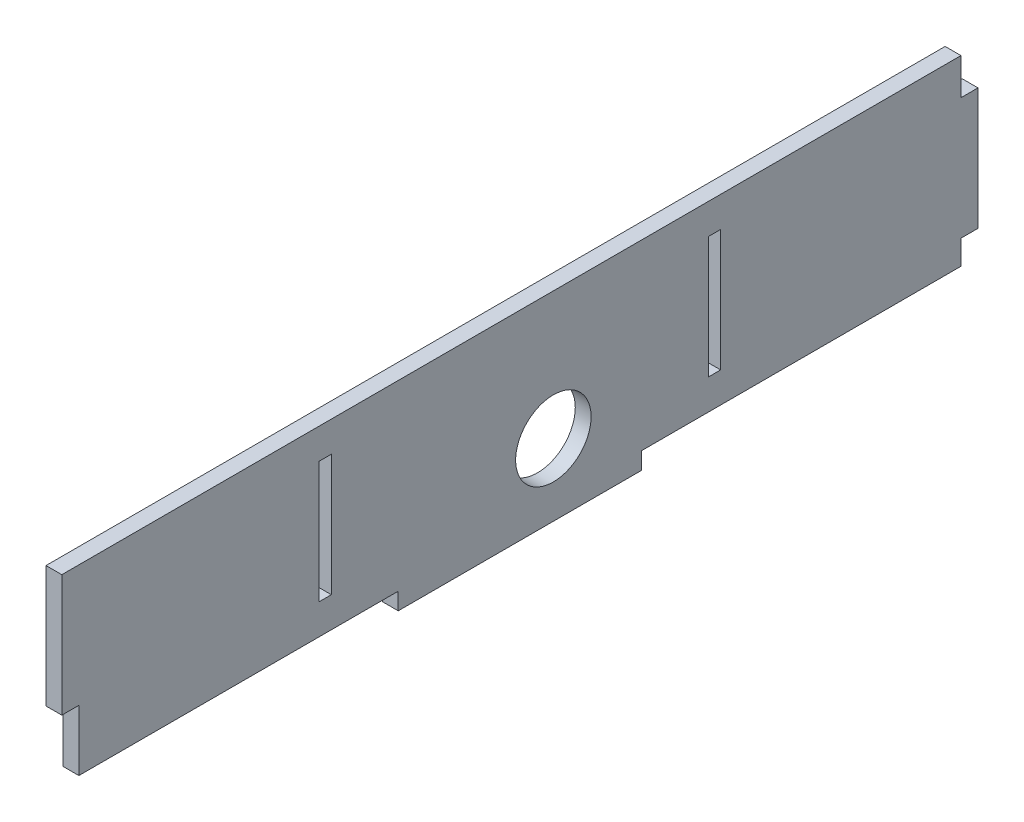
ISO-10303-21;
HEADER;
FILE_DESCRIPTION(('STEP AP214'),'2;1');
FILE_NAME('part.step','',(''),(''),'','','');
FILE_SCHEMA(('AUTOMOTIVE_DESIGN { 1 0 10303 214 1 1 1 1 }'));
ENDSEC;
DATA;
#1=APPLICATION_CONTEXT('core data for automotive mechanical design processes');
#2=APPLICATION_PROTOCOL_DEFINITION('international standard','automotive_design',2000,#1);
#3=PRODUCT_CONTEXT('',#1,'mechanical');
#4=PRODUCT('Part','Part','',(#3));
#5=PRODUCT_RELATED_PRODUCT_CATEGORY('part','',(#4));
#6=PRODUCT_DEFINITION_FORMATION('','',#4);
#7=PRODUCT_DEFINITION_CONTEXT('part definition',#1,'design');
#8=PRODUCT_DEFINITION('design','',#6,#7);
#9=PRODUCT_DEFINITION_SHAPE('','',#8);
#10=(LENGTH_UNIT() NAMED_UNIT(*) SI_UNIT(.MILLI.,.METRE.));
#11=(NAMED_UNIT(*) PLANE_ANGLE_UNIT() SI_UNIT($,.RADIAN.));
#12=(NAMED_UNIT(*) SI_UNIT($,.STERADIAN.) SOLID_ANGLE_UNIT());
#13=UNCERTAINTY_MEASURE_WITH_UNIT(LENGTH_MEASURE(1.E-05),#10,'distance_accuracy_value','');
#14=(GEOMETRIC_REPRESENTATION_CONTEXT(3) GLOBAL_UNCERTAINTY_ASSIGNED_CONTEXT((#13)) GLOBAL_UNIT_ASSIGNED_CONTEXT((#10,
#11,#12)) REPRESENTATION_CONTEXT('',''));
#15=CARTESIAN_POINT('',(0.,0.,0.));
#16=DIRECTION('',(0.,0.,1.));
#17=DIRECTION('',(1.,0.,0.));
#18=AXIS2_PLACEMENT_3D('',#15,#16,#17);
#19=CARTESIAN_POINT('',(1.3,-7.5,36.25));
#20=DIRECTION('',(0.,1.,0.));
#21=DIRECTION('',(0.,0.,1.));
#22=AXIS2_PLACEMENT_3D('',#19,#20,#21);
#23=PLANE('',#22);
#24=DIRECTION('',(1.,0.,0.));
#25=VECTOR('',#24,1.);
#26=CARTESIAN_POINT('',(0.,-7.49999999999999,-10.));
#27=LINE('',#26,#25);
#28=CARTESIAN_POINT('',(0.,-7.49999999999999,-10.));
#29=VERTEX_POINT('',#28);
#30=CARTESIAN_POINT('',(1.3,-7.49999999999999,-10.));
#31=VERTEX_POINT('',#30);
#32=EDGE_CURVE('E297',#29,#31,#27,.T.);
#33=ORIENTED_EDGE('',*,*,#32,.F.);
#34=DIRECTION('',(0.,0.,-1.));
#35=VECTOR('',#34,1.);
#36=CARTESIAN_POINT('',(0.,-7.5,36.25));
#37=LINE('',#36,#35);
#38=CARTESIAN_POINT('',(0.,-7.5,-36.25));
#39=VERTEX_POINT('',#38);
#40=EDGE_CURVE('E416',#29,#39,#37,.T.);
#41=ORIENTED_EDGE('',*,*,#40,.T.);
#42=DIRECTION('',(-1.,0.,0.));
#43=VECTOR('',#42,1.);
#44=CARTESIAN_POINT('',(1.3,-7.5,-36.25));
#45=LINE('',#44,#43);
#46=CARTESIAN_POINT('',(1.3,-7.5,-36.25));
#47=VERTEX_POINT('',#46);
#48=EDGE_CURVE('E405',#47,#39,#45,.T.);
#49=ORIENTED_EDGE('',*,*,#48,.F.);
#50=DIRECTION('',(0.,0.,-1.));
#51=VECTOR('',#50,1.);
#52=CARTESIAN_POINT('',(1.3,-7.5,36.25));
#53=LINE('',#52,#51);
#54=EDGE_CURVE('E400',#31,#47,#53,.T.);
#55=ORIENTED_EDGE('',*,*,#54,.F.);
#56=EDGE_LOOP('',(#33,#41,#49,#55));
#57=FACE_BOUND('',#56,.T.);
#58=ADVANCED_FACE('F42',(#57),#23,.F.);
#59=CARTESIAN_POINT('',(1.3,7.5,-36.25));
#60=DIRECTION('',(0.,0.,1.));
#61=DIRECTION('',(1.,0.,0.));
#62=AXIS2_PLACEMENT_3D('',#59,#60,#61);
#63=PLANE('',#62);
#64=DIRECTION('',(1.,0.,0.));
#65=VECTOR('',#64,1.);
#66=CARTESIAN_POINT('',(0.,4.5,-36.25));
#67=LINE('',#66,#65);
#68=CARTESIAN_POINT('',(0.,4.5,-36.25));
#69=VERTEX_POINT('',#68);
#70=CARTESIAN_POINT('',(1.3,4.5,-36.25));
#71=VERTEX_POINT('',#70);
#72=EDGE_CURVE('E316',#69,#71,#67,.T.);
#73=ORIENTED_EDGE('',*,*,#72,.F.);
#74=DIRECTION('',(0.,1.,0.));
#75=VECTOR('',#74,1.);
#76=CARTESIAN_POINT('',(0.,7.5,-36.25));
#77=LINE('',#76,#75);
#78=CARTESIAN_POINT('',(0.,7.5,-36.25));
#79=VERTEX_POINT('',#78);
#80=EDGE_CURVE('E382',#69,#79,#77,.T.);
#81=ORIENTED_EDGE('',*,*,#80,.T.);
#82=DIRECTION('',(-1.,0.,0.));
#83=VECTOR('',#82,1.);
#84=CARTESIAN_POINT('',(1.3,7.5,-36.25));
#85=LINE('',#84,#83);
#86=CARTESIAN_POINT('',(1.3,7.5,-36.25));
#87=VERTEX_POINT('',#86);
#88=EDGE_CURVE('E11',#87,#79,#85,.T.);
#89=ORIENTED_EDGE('',*,*,#88,.F.);
#90=DIRECTION('',(0.,1.,0.));
#91=VECTOR('',#90,1.);
#92=CARTESIAN_POINT('',(1.3,7.5,-36.25));
#93=LINE('',#92,#91);
#94=EDGE_CURVE('E394',#71,#87,#93,.T.);
#95=ORIENTED_EDGE('',*,*,#94,.F.);
#96=EDGE_LOOP('',(#73,#81,#89,#95));
#97=FACE_BOUND('',#96,.T.);
#98=ADVANCED_FACE('F461',(#97),#63,.F.);
#99=CARTESIAN_POINT('',(1.3,7.5,36.25));
#100=DIRECTION('',(0.,0.,-1.));
#101=DIRECTION('',(-1.,0.,0.));
#102=AXIS2_PLACEMENT_3D('',#99,#100,#101);
#103=PLANE('',#102);
#104=DIRECTION('',(1.,0.,0.));
#105=VECTOR('',#104,1.);
#106=CARTESIAN_POINT('',(0.,-2.5,36.25));
#107=LINE('',#106,#105);
#108=CARTESIAN_POINT('',(0.,-2.5,36.25));
#109=VERTEX_POINT('',#108);
#110=CARTESIAN_POINT('',(1.3,-2.5,36.25));
#111=VERTEX_POINT('',#110);
#112=EDGE_CURVE('E378',#109,#111,#107,.T.);
#113=ORIENTED_EDGE('',*,*,#112,.F.);
#114=DIRECTION('',(0.,-1.,0.));
#115=VECTOR('',#114,1.);
#116=CARTESIAN_POINT('',(0.,7.5,36.25));
#117=LINE('',#116,#115);
#118=CARTESIAN_POINT('',(0.,-7.5,36.25));
#119=VERTEX_POINT('',#118);
#120=EDGE_CURVE('E413',#109,#119,#117,.T.);
#121=ORIENTED_EDGE('',*,*,#120,.T.);
#122=DIRECTION('',(-1.,0.,0.));
#123=VECTOR('',#122,1.);
#124=CARTESIAN_POINT('',(1.3,-7.5,36.25));
#125=LINE('',#124,#123);
#126=CARTESIAN_POINT('',(1.3,-7.5,36.25));
#127=VERTEX_POINT('',#126);
#128=EDGE_CURVE('E51',#127,#119,#125,.T.);
#129=ORIENTED_EDGE('',*,*,#128,.F.);
#130=DIRECTION('',(0.,-1.,0.));
#131=VECTOR('',#130,1.);
#132=CARTESIAN_POINT('',(1.3,7.5,36.25));
#133=LINE('',#132,#131);
#134=EDGE_CURVE('E397',#111,#127,#133,.T.);
#135=ORIENTED_EDGE('',*,*,#134,.F.);
#136=EDGE_LOOP('',(#113,#121,#129,#135));
#137=FACE_BOUND('',#136,.T.);
#138=ADVANCED_FACE('F444',(#137),#103,.F.);
#139=CARTESIAN_POINT('',(0.,-5.5,-36.25));
#140=VERTEX_POINT('',#139);
#141=EDGE_CURVE('E406',#39,#140,#77,.T.);
#142=ORIENTED_EDGE('',*,*,#141,.T.);
#143=DIRECTION('',(1.,0.,0.));
#144=VECTOR('',#143,1.);
#145=CARTESIAN_POINT('',(0.,-5.5,-36.25));
#146=LINE('',#145,#144);
#147=CARTESIAN_POINT('',(1.3,-5.5,-36.25));
#148=VERTEX_POINT('',#147);
#149=EDGE_CURVE('E326',#140,#148,#146,.T.);
#150=ORIENTED_EDGE('',*,*,#149,.T.);
#151=EDGE_CURVE('E389',#47,#148,#93,.T.);
#152=ORIENTED_EDGE('',*,*,#151,.F.);
#153=ORIENTED_EDGE('',*,*,#48,.T.);
#154=EDGE_LOOP('',(#142,#150,#152,#153));
#155=FACE_BOUND('',#154,.T.);
#156=ADVANCED_FACE('F44',(#155),#63,.F.);
#157=CARTESIAN_POINT('',(1.3,7.5,36.25));
#158=DIRECTION('',(0.,-1.,0.));
#159=DIRECTION('',(0.,0.,-1.));
#160=AXIS2_PLACEMENT_3D('',#157,#158,#159);
#161=PLANE('',#160);
#162=DIRECTION('',(0.,0.,1.));
#163=VECTOR('',#162,1.);
#164=CARTESIAN_POINT('',(0.,7.5,36.25));
#165=LINE('',#164,#163);
#166=CARTESIAN_POINT('',(0.,7.5,37.65));
#167=VERTEX_POINT('',#166);
#168=EDGE_CURVE('E410',#79,#167,#165,.T.);
#169=ORIENTED_EDGE('',*,*,#168,.T.);
#170=DIRECTION('',(1.,0.,0.));
#171=VECTOR('',#170,1.);
#172=CARTESIAN_POINT('',(0.,7.5,37.65));
#173=LINE('',#172,#171);
#174=CARTESIAN_POINT('',(1.3,7.5,37.65));
#175=VERTEX_POINT('',#174);
#176=EDGE_CURVE('E371',#167,#175,#173,.T.);
#177=ORIENTED_EDGE('',*,*,#176,.T.);
#178=DIRECTION('',(0.,0.,1.));
#179=VECTOR('',#178,1.);
#180=CARTESIAN_POINT('',(1.3,7.5,36.25));
#181=LINE('',#180,#179);
#182=EDGE_CURVE('E393',#87,#175,#181,.T.);
#183=ORIENTED_EDGE('',*,*,#182,.F.);
#184=ORIENTED_EDGE('',*,*,#88,.T.);
#185=EDGE_LOOP('',(#169,#177,#183,#184));
#186=FACE_BOUND('',#185,.T.);
#187=ADVANCED_FACE('F456',(#186),#161,.F.);
#188=CARTESIAN_POINT('',(0.,-7.5,9.99999999999999));
#189=VERTEX_POINT('',#188);
#190=EDGE_CURVE('E417',#119,#189,#37,.T.);
#191=ORIENTED_EDGE('',*,*,#190,.T.);
#192=DIRECTION('',(1.,0.,0.));
#193=VECTOR('',#192,1.);
#194=CARTESIAN_POINT('',(0.,-7.5,9.99999999999999));
#195=LINE('',#194,#193);
#196=CARTESIAN_POINT('',(1.3,-7.5,9.99999999999999));
#197=VERTEX_POINT('',#196);
#198=EDGE_CURVE('E241',#189,#197,#195,.T.);
#199=ORIENTED_EDGE('',*,*,#198,.T.);
#200=EDGE_CURVE('E401',#127,#197,#53,.T.);
#201=ORIENTED_EDGE('',*,*,#200,.F.);
#202=ORIENTED_EDGE('',*,*,#128,.T.);
#203=EDGE_LOOP('',(#191,#199,#201,#202));
#204=FACE_BOUND('',#203,.T.);
#205=ADVANCED_FACE('F429',(#204),#23,.F.);
#206=CARTESIAN_POINT('',(1.3,0.,0.));
#207=DIRECTION('',(1.,0.,0.));
#208=DIRECTION('',(0.,0.,-1.));
#209=AXIS2_PLACEMENT_3D('',#206,#207,#208);
#210=PLANE('',#209);
#211=CARTESIAN_POINT('',(1.3,-3.,-2.75));
#212=DIRECTION('',(1.,0.,0.));
#213=DIRECTION('',(0.,0.,-1.));
#214=AXIS2_PLACEMENT_3D('',#211,#212,#213);
#215=CIRCLE('',#214,3.1);
#216=CARTESIAN_POINT('',(1.3,-3.,-5.85));
#217=VERTEX_POINT('',#216);
#218=EDGE_CURVE('E223',#217,#217,#215,.T.);
#219=ORIENTED_EDGE('',*,*,#218,.F.);
#220=EDGE_LOOP('',(#219));
#221=FACE_BOUND('',#220,.T.);
#222=DIRECTION('',(0.,1.,0.));
#223=VECTOR('',#222,1.);
#224=CARTESIAN_POINT('',(1.3,5.,-16.5));
#225=LINE('',#224,#223);
#226=CARTESIAN_POINT('',(1.3,-5.,-16.5));
#227=VERTEX_POINT('',#226);
#228=CARTESIAN_POINT('',(1.3,5.,-16.5));
#229=VERTEX_POINT('',#228);
#230=EDGE_CURVE('E58',#227,#229,#225,.T.);
#231=ORIENTED_EDGE('',*,*,#230,.F.);
#232=DIRECTION('',(0.,0.,-1.));
#233=VECTOR('',#232,1.);
#234=CARTESIAN_POINT('',(1.3,-5.,-15.5));
#235=LINE('',#234,#233);
#236=CARTESIAN_POINT('',(1.3,-5.,-15.5));
#237=VERTEX_POINT('',#236);
#238=EDGE_CURVE('E216',#237,#227,#235,.T.);
#239=ORIENTED_EDGE('',*,*,#238,.F.);
#240=DIRECTION('',(0.,-1.,0.));
#241=VECTOR('',#240,1.);
#242=CARTESIAN_POINT('',(1.3,5.,-15.5));
#243=LINE('',#242,#241);
#244=CARTESIAN_POINT('',(1.3,5.,-15.5));
#245=VERTEX_POINT('',#244);
#246=EDGE_CURVE('E220',#245,#237,#243,.T.);
#247=ORIENTED_EDGE('',*,*,#246,.F.);
#248=DIRECTION('',(0.,0.,1.));
#249=VECTOR('',#248,1.);
#250=CARTESIAN_POINT('',(1.3,5.,-15.5));
#251=LINE('',#250,#249);
#252=EDGE_CURVE('E232',#229,#245,#251,.T.);
#253=ORIENTED_EDGE('',*,*,#252,.F.);
#254=EDGE_LOOP('',(#231,#239,#247,#253));
#255=FACE_BOUND('',#254,.T.);
#256=DIRECTION('',(0.,1.,0.));
#257=VECTOR('',#256,1.);
#258=CARTESIAN_POINT('',(1.3,4.99999999999999,15.5));
#259=LINE('',#258,#257);
#260=CARTESIAN_POINT('',(1.3,-5.00000000000001,15.5));
#261=VERTEX_POINT('',#260);
#262=CARTESIAN_POINT('',(1.3,4.99999999999999,15.5));
#263=VERTEX_POINT('',#262);
#264=EDGE_CURVE('E66',#261,#263,#259,.T.);
#265=ORIENTED_EDGE('',*,*,#264,.F.);
#266=DIRECTION('',(0.,0.,-1.));
#267=VECTOR('',#266,1.);
#268=CARTESIAN_POINT('',(1.3,-5.00000000000001,16.5));
#269=LINE('',#268,#267);
#270=CARTESIAN_POINT('',(1.3,-5.00000000000001,16.5));
#271=VERTEX_POINT('',#270);
#272=EDGE_CURVE('E261',#271,#261,#269,.T.);
#273=ORIENTED_EDGE('',*,*,#272,.F.);
#274=DIRECTION('',(0.,-1.,0.));
#275=VECTOR('',#274,1.);
#276=CARTESIAN_POINT('',(1.3,4.99999999999999,16.5));
#277=LINE('',#276,#275);
#278=CARTESIAN_POINT('',(1.3,4.99999999999999,16.5));
#279=VERTEX_POINT('',#278);
#280=EDGE_CURVE('E265',#279,#271,#277,.T.);
#281=ORIENTED_EDGE('',*,*,#280,.F.);
#282=DIRECTION('',(0.,0.,1.));
#283=VECTOR('',#282,1.);
#284=CARTESIAN_POINT('',(1.3,4.99999999999999,16.5));
#285=LINE('',#284,#283);
#286=EDGE_CURVE('E270',#263,#279,#285,.T.);
#287=ORIENTED_EDGE('',*,*,#286,.F.);
#288=EDGE_LOOP('',(#265,#273,#281,#287));
#289=FACE_BOUND('',#288,.T.);
#290=ORIENTED_EDGE('',*,*,#151,.T.);
#291=DIRECTION('',(0.,0.,-1.));
#292=VECTOR('',#291,1.);
#293=CARTESIAN_POINT('',(1.3,-5.5,-36.25));
#294=LINE('',#293,#292);
#295=CARTESIAN_POINT('',(1.3,-5.5,-37.65));
#296=VERTEX_POINT('',#295);
#297=EDGE_CURVE('E348',#148,#296,#294,.T.);
#298=ORIENTED_EDGE('',*,*,#297,.T.);
#299=DIRECTION('',(0.,1.,0.));
#300=VECTOR('',#299,1.);
#301=CARTESIAN_POINT('',(1.3,4.5,-37.65));
#302=LINE('',#301,#300);
#303=CARTESIAN_POINT('',(1.3,4.5,-37.65));
#304=VERTEX_POINT('',#303);
#305=EDGE_CURVE('E343',#296,#304,#302,.T.);
#306=ORIENTED_EDGE('',*,*,#305,.T.);
#307=DIRECTION('',(0.,0.,1.));
#308=VECTOR('',#307,1.);
#309=CARTESIAN_POINT('',(1.3,4.5,-36.25));
#310=LINE('',#309,#308);
#311=EDGE_CURVE('E339',#304,#71,#310,.T.);
#312=ORIENTED_EDGE('',*,*,#311,.T.);
#313=ORIENTED_EDGE('',*,*,#94,.T.);
#314=ORIENTED_EDGE('',*,*,#182,.T.);
#315=DIRECTION('',(0.,-1.,0.));
#316=VECTOR('',#315,1.);
#317=CARTESIAN_POINT('',(1.3,7.5,37.65));
#318=LINE('',#317,#316);
#319=CARTESIAN_POINT('',(1.3,-2.5,37.65));
#320=VERTEX_POINT('',#319);
#321=EDGE_CURVE('E352',#175,#320,#318,.T.);
#322=ORIENTED_EDGE('',*,*,#321,.T.);
#323=DIRECTION('',(0.,0.,-1.));
#324=VECTOR('',#323,1.);
#325=CARTESIAN_POINT('',(1.3,-2.5,36.25));
#326=LINE('',#325,#324);
#327=EDGE_CURVE('E367',#320,#111,#326,.T.);
#328=ORIENTED_EDGE('',*,*,#327,.T.);
#329=ORIENTED_EDGE('',*,*,#134,.T.);
#330=ORIENTED_EDGE('',*,*,#200,.T.);
#331=DIRECTION('',(0.,-1.,0.));
#332=VECTOR('',#331,1.);
#333=CARTESIAN_POINT('',(1.3,-7.5,9.99999999999999));
#334=LINE('',#333,#332);
#335=CARTESIAN_POINT('',(1.3,-8.89999999999999,10.));
#336=VERTEX_POINT('',#335);
#337=EDGE_CURVE('E312',#197,#336,#334,.T.);
#338=ORIENTED_EDGE('',*,*,#337,.T.);
#339=DIRECTION('',(0.,0.,-1.));
#340=VECTOR('',#339,1.);
#341=CARTESIAN_POINT('',(1.3,-8.89999999999999,10.));
#342=LINE('',#341,#340);
#343=CARTESIAN_POINT('',(1.3,-8.89999999999999,-10.));
#344=VERTEX_POINT('',#343);
#345=EDGE_CURVE('E307',#336,#344,#342,.T.);
#346=ORIENTED_EDGE('',*,*,#345,.T.);
#347=DIRECTION('',(0.,1.,0.));
#348=VECTOR('',#347,1.);
#349=CARTESIAN_POINT('',(1.3,-7.49999999999999,-10.));
#350=LINE('',#349,#348);
#351=EDGE_CURVE('E303',#344,#31,#350,.T.);
#352=ORIENTED_EDGE('',*,*,#351,.T.);
#353=ORIENTED_EDGE('',*,*,#54,.T.);
#354=EDGE_LOOP('',(#290,#298,#306,#312,#313,#314,#322,#328,#329,#330,#338,#346,#352,#353));
#355=FACE_BOUND('',#354,.T.);
#356=ADVANCED_FACE('F442',(#221,#255,#289,#355),#210,.T.);
#357=CARTESIAN_POINT('',(0.,0.,0.));
#358=DIRECTION('',(1.,0.,0.));
#359=DIRECTION('',(0.,0.,-1.));
#360=AXIS2_PLACEMENT_3D('',#357,#358,#359);
#361=PLANE('',#360);
#362=CARTESIAN_POINT('',(0.,-3.,-2.75));
#363=DIRECTION('',(1.,0.,0.));
#364=DIRECTION('',(0.,0.,-1.));
#365=AXIS2_PLACEMENT_3D('',#362,#363,#364);
#366=CIRCLE('',#365,3.1);
#367=CARTESIAN_POINT('',(0.,-3.,-5.85));
#368=VERTEX_POINT('',#367);
#369=EDGE_CURVE('E260',#368,#368,#366,.T.);
#370=ORIENTED_EDGE('',*,*,#369,.T.);
#371=EDGE_LOOP('',(#370));
#372=FACE_BOUND('',#371,.T.);
#373=DIRECTION('',(0.,0.,-1.));
#374=VECTOR('',#373,1.);
#375=CARTESIAN_POINT('',(0.,-5.,-15.5));
#376=LINE('',#375,#374);
#377=CARTESIAN_POINT('',(0.,-5.,-15.5));
#378=VERTEX_POINT('',#377);
#379=CARTESIAN_POINT('',(0.,-5.,-16.5));
#380=VERTEX_POINT('',#379);
#381=EDGE_CURVE('E201',#378,#380,#376,.T.);
#382=ORIENTED_EDGE('',*,*,#381,.T.);
#383=DIRECTION('',(0.,1.,0.));
#384=VECTOR('',#383,1.);
#385=CARTESIAN_POINT('',(0.,5.,-16.5));
#386=LINE('',#385,#384);
#387=CARTESIAN_POINT('',(0.,5.,-16.5));
#388=VERTEX_POINT('',#387);
#389=EDGE_CURVE('E194',#380,#388,#386,.T.);
#390=ORIENTED_EDGE('',*,*,#389,.T.);
#391=DIRECTION('',(0.,0.,1.));
#392=VECTOR('',#391,1.);
#393=CARTESIAN_POINT('',(0.,5.,-15.5));
#394=LINE('',#393,#392);
#395=CARTESIAN_POINT('',(0.,5.,-15.5));
#396=VERTEX_POINT('',#395);
#397=EDGE_CURVE('E205',#388,#396,#394,.T.);
#398=ORIENTED_EDGE('',*,*,#397,.T.);
#399=DIRECTION('',(0.,-1.,0.));
#400=VECTOR('',#399,1.);
#401=CARTESIAN_POINT('',(0.,5.,-15.5));
#402=LINE('',#401,#400);
#403=EDGE_CURVE('E210',#396,#378,#402,.T.);
#404=ORIENTED_EDGE('',*,*,#403,.T.);
#405=EDGE_LOOP('',(#382,#390,#398,#404));
#406=FACE_BOUND('',#405,.T.);
#407=DIRECTION('',(0.,0.,-1.));
#408=VECTOR('',#407,1.);
#409=CARTESIAN_POINT('',(0.,-5.00000000000001,16.5));
#410=LINE('',#409,#408);
#411=CARTESIAN_POINT('',(0.,-5.00000000000001,16.5));
#412=VERTEX_POINT('',#411);
#413=CARTESIAN_POINT('',(0.,-5.00000000000001,15.5));
#414=VERTEX_POINT('',#413);
#415=EDGE_CURVE('E250',#412,#414,#410,.T.);
#416=ORIENTED_EDGE('',*,*,#415,.T.);
#417=DIRECTION('',(0.,1.,0.));
#418=VECTOR('',#417,1.);
#419=CARTESIAN_POINT('',(0.,4.99999999999999,15.5));
#420=LINE('',#419,#418);
#421=CARTESIAN_POINT('',(0.,4.99999999999999,15.5));
#422=VERTEX_POINT('',#421);
#423=EDGE_CURVE('E266',#414,#422,#420,.T.);
#424=ORIENTED_EDGE('',*,*,#423,.T.);
#425=DIRECTION('',(0.,0.,1.));
#426=VECTOR('',#425,1.);
#427=CARTESIAN_POINT('',(0.,4.99999999999999,16.5));
#428=LINE('',#427,#426);
#429=CARTESIAN_POINT('',(0.,4.99999999999999,16.5));
#430=VERTEX_POINT('',#429);
#431=EDGE_CURVE('E283',#422,#430,#428,.T.);
#432=ORIENTED_EDGE('',*,*,#431,.T.);
#433=DIRECTION('',(0.,-1.,0.));
#434=VECTOR('',#433,1.);
#435=CARTESIAN_POINT('',(0.,4.99999999999999,16.5));
#436=LINE('',#435,#434);
#437=EDGE_CURVE('E279',#430,#412,#436,.T.);
#438=ORIENTED_EDGE('',*,*,#437,.T.);
#439=EDGE_LOOP('',(#416,#424,#432,#438));
#440=FACE_BOUND('',#439,.T.);
#441=ORIENTED_EDGE('',*,*,#141,.F.);
#442=ORIENTED_EDGE('',*,*,#40,.F.);
#443=DIRECTION('',(0.,1.,0.));
#444=VECTOR('',#443,1.);
#445=CARTESIAN_POINT('',(0.,-7.49999999999999,-10.));
#446=LINE('',#445,#444);
#447=CARTESIAN_POINT('',(0.,-8.89999999999999,-10.));
#448=VERTEX_POINT('',#447);
#449=EDGE_CURVE('E293',#448,#29,#446,.T.);
#450=ORIENTED_EDGE('',*,*,#449,.F.);
#451=DIRECTION('',(0.,0.,-1.));
#452=VECTOR('',#451,1.);
#453=CARTESIAN_POINT('',(0.,-8.89999999999999,10.));
#454=LINE('',#453,#452);
#455=CARTESIAN_POINT('',(0.,-8.89999999999999,10.));
#456=VERTEX_POINT('',#455);
#457=EDGE_CURVE('E319',#456,#448,#454,.T.);
#458=ORIENTED_EDGE('',*,*,#457,.F.);
#459=DIRECTION('',(0.,-1.,0.));
#460=VECTOR('',#459,1.);
#461=CARTESIAN_POINT('',(0.,-7.5,9.99999999999999));
#462=LINE('',#461,#460);
#463=EDGE_CURVE('E308',#189,#456,#462,.T.);
#464=ORIENTED_EDGE('',*,*,#463,.F.);
#465=ORIENTED_EDGE('',*,*,#190,.F.);
#466=ORIENTED_EDGE('',*,*,#120,.F.);
#467=DIRECTION('',(0.,0.,-1.));
#468=VECTOR('',#467,1.);
#469=CARTESIAN_POINT('',(0.,-2.5,36.25));
#470=LINE('',#469,#468);
#471=CARTESIAN_POINT('',(0.,-2.5,37.65));
#472=VERTEX_POINT('',#471);
#473=EDGE_CURVE('E366',#472,#109,#470,.T.);
#474=ORIENTED_EDGE('',*,*,#473,.F.);
#475=DIRECTION('',(0.,-1.,0.));
#476=VECTOR('',#475,1.);
#477=CARTESIAN_POINT('',(0.,7.5,37.65));
#478=LINE('',#477,#476);
#479=EDGE_CURVE('E362',#167,#472,#478,.T.);
#480=ORIENTED_EDGE('',*,*,#479,.F.);
#481=ORIENTED_EDGE('',*,*,#168,.F.);
#482=ORIENTED_EDGE('',*,*,#80,.F.);
#483=DIRECTION('',(0.,0.,1.));
#484=VECTOR('',#483,1.);
#485=CARTESIAN_POINT('',(0.,4.5,-36.25));
#486=LINE('',#485,#484);
#487=CARTESIAN_POINT('',(0.,4.5,-37.65));
#488=VERTEX_POINT('',#487);
#489=EDGE_CURVE('E330',#488,#69,#486,.T.);
#490=ORIENTED_EDGE('',*,*,#489,.F.);
#491=DIRECTION('',(0.,1.,0.));
#492=VECTOR('',#491,1.);
#493=CARTESIAN_POINT('',(0.,4.5,-37.65));
#494=LINE('',#493,#492);
#495=CARTESIAN_POINT('',(0.,-5.5,-37.65));
#496=VERTEX_POINT('',#495);
#497=EDGE_CURVE('E355',#496,#488,#494,.T.);
#498=ORIENTED_EDGE('',*,*,#497,.F.);
#499=DIRECTION('',(0.,0.,-1.));
#500=VECTOR('',#499,1.);
#501=CARTESIAN_POINT('',(0.,-5.5,-36.25));
#502=LINE('',#501,#500);
#503=EDGE_CURVE('E344',#140,#496,#502,.T.);
#504=ORIENTED_EDGE('',*,*,#503,.F.);
#505=EDGE_LOOP('',(#441,#442,#450,#458,#464,#465,#466,#474,#480,#481,#482,#490,#498,#504));
#506=FACE_BOUND('',#505,.T.);
#507=ADVANCED_FACE('F212',(#372,#406,#440,#506),#361,.F.);
#508=CARTESIAN_POINT('',(0.,-2.5,36.25));
#509=DIRECTION('',(0.,-1.,0.));
#510=DIRECTION('',(0.,0.,-1.));
#511=AXIS2_PLACEMENT_3D('',#508,#509,#510);
#512=PLANE('',#511);
#513=ORIENTED_EDGE('',*,*,#327,.F.);
#514=DIRECTION('',(1.,0.,0.));
#515=VECTOR('',#514,1.);
#516=CARTESIAN_POINT('',(0.,-2.5,37.65));
#517=LINE('',#516,#515);
#518=EDGE_CURVE('E383',#472,#320,#517,.T.);
#519=ORIENTED_EDGE('',*,*,#518,.F.);
#520=ORIENTED_EDGE('',*,*,#473,.T.);
#521=ORIENTED_EDGE('',*,*,#112,.T.);
#522=EDGE_LOOP('',(#513,#519,#520,#521));
#523=FACE_BOUND('',#522,.T.);
#524=ADVANCED_FACE('F446',(#523),#512,.T.);
#525=CARTESIAN_POINT('',(0.,7.5,37.65));
#526=DIRECTION('',(0.,0.,1.));
#527=DIRECTION('',(1.,0.,0.));
#528=AXIS2_PLACEMENT_3D('',#525,#526,#527);
#529=PLANE('',#528);
#530=ORIENTED_EDGE('',*,*,#321,.F.);
#531=ORIENTED_EDGE('',*,*,#176,.F.);
#532=ORIENTED_EDGE('',*,*,#479,.T.);
#533=ORIENTED_EDGE('',*,*,#518,.T.);
#534=EDGE_LOOP('',(#530,#531,#532,#533));
#535=FACE_BOUND('',#534,.T.);
#536=ADVANCED_FACE('F453',(#535),#529,.T.);
#537=CARTESIAN_POINT('',(0.,4.5,-36.25));
#538=DIRECTION('',(0.,1.,0.));
#539=DIRECTION('',(0.,0.,1.));
#540=AXIS2_PLACEMENT_3D('',#537,#538,#539);
#541=PLANE('',#540);
#542=ORIENTED_EDGE('',*,*,#311,.F.);
#543=DIRECTION('',(1.,0.,0.));
#544=VECTOR('',#543,1.);
#545=CARTESIAN_POINT('',(0.,4.5,-37.65));
#546=LINE('',#545,#544);
#547=EDGE_CURVE('E334',#488,#304,#546,.T.);
#548=ORIENTED_EDGE('',*,*,#547,.F.);
#549=ORIENTED_EDGE('',*,*,#489,.T.);
#550=ORIENTED_EDGE('',*,*,#72,.T.);
#551=EDGE_LOOP('',(#542,#548,#549,#550));
#552=FACE_BOUND('',#551,.T.);
#553=ADVANCED_FACE('F484',(#552),#541,.T.);
#554=CARTESIAN_POINT('',(0.,4.5,-37.65));
#555=DIRECTION('',(0.,0.,-1.));
#556=DIRECTION('',(-1.,0.,0.));
#557=AXIS2_PLACEMENT_3D('',#554,#555,#556);
#558=PLANE('',#557);
#559=ORIENTED_EDGE('',*,*,#305,.F.);
#560=DIRECTION('',(1.,0.,0.));
#561=VECTOR('',#560,1.);
#562=CARTESIAN_POINT('',(0.,-5.5,-37.65));
#563=LINE('',#562,#561);
#564=EDGE_CURVE('E331',#496,#296,#563,.T.);
#565=ORIENTED_EDGE('',*,*,#564,.F.);
#566=ORIENTED_EDGE('',*,*,#497,.T.);
#567=ORIENTED_EDGE('',*,*,#547,.T.);
#568=EDGE_LOOP('',(#559,#565,#566,#567));
#569=FACE_BOUND('',#568,.T.);
#570=ADVANCED_FACE('F481',(#569),#558,.T.);
#571=CARTESIAN_POINT('',(0.,-5.5,-36.25));
#572=DIRECTION('',(0.,-1.,0.));
#573=DIRECTION('',(0.,0.,-1.));
#574=AXIS2_PLACEMENT_3D('',#571,#572,#573);
#575=PLANE('',#574);
#576=ORIENTED_EDGE('',*,*,#297,.F.);
#577=ORIENTED_EDGE('',*,*,#149,.F.);
#578=ORIENTED_EDGE('',*,*,#503,.T.);
#579=ORIENTED_EDGE('',*,*,#564,.T.);
#580=EDGE_LOOP('',(#576,#577,#578,#579));
#581=FACE_BOUND('',#580,.T.);
#582=ADVANCED_FACE('F477',(#581),#575,.T.);
#583=CARTESIAN_POINT('',(0.,-7.5,9.99999999999999));
#584=DIRECTION('',(0.,0.,1.));
#585=DIRECTION('',(0.,-1.,0.));
#586=AXIS2_PLACEMENT_3D('',#583,#584,#585);
#587=PLANE('',#586);
#588=ORIENTED_EDGE('',*,*,#337,.F.);
#589=ORIENTED_EDGE('',*,*,#198,.F.);
#590=ORIENTED_EDGE('',*,*,#463,.T.);
#591=DIRECTION('',(1.,0.,0.));
#592=VECTOR('',#591,1.);
#593=CARTESIAN_POINT('',(0.,-8.89999999999999,10.));
#594=LINE('',#593,#592);
#595=EDGE_CURVE('E290',#456,#336,#594,.T.);
#596=ORIENTED_EDGE('',*,*,#595,.T.);
#597=EDGE_LOOP('',(#588,#589,#590,#596));
#598=FACE_BOUND('',#597,.T.);
#599=ADVANCED_FACE('F439',(#598),#587,.T.);
#600=CARTESIAN_POINT('',(0.,-7.49999999999999,-10.));
#601=DIRECTION('',(0.,0.,-1.));
#602=DIRECTION('',(0.,1.,0.));
#603=AXIS2_PLACEMENT_3D('',#600,#601,#602);
#604=PLANE('',#603);
#605=ORIENTED_EDGE('',*,*,#351,.F.);
#606=DIRECTION('',(1.,0.,0.));
#607=VECTOR('',#606,1.);
#608=CARTESIAN_POINT('',(0.,-8.89999999999999,-10.));
#609=LINE('',#608,#607);
#610=EDGE_CURVE('E294',#448,#344,#609,.T.);
#611=ORIENTED_EDGE('',*,*,#610,.F.);
#612=ORIENTED_EDGE('',*,*,#449,.T.);
#613=ORIENTED_EDGE('',*,*,#32,.T.);
#614=EDGE_LOOP('',(#605,#611,#612,#613));
#615=FACE_BOUND('',#614,.T.);
#616=ADVANCED_FACE('F582',(#615),#604,.T.);
#617=CARTESIAN_POINT('',(0.,-8.89999999999999,10.));
#618=DIRECTION('',(0.,-1.,0.));
#619=DIRECTION('',(0.,0.,-1.));
#620=AXIS2_PLACEMENT_3D('',#617,#618,#619);
#621=PLANE('',#620);
#622=ORIENTED_EDGE('',*,*,#345,.F.);
#623=ORIENTED_EDGE('',*,*,#595,.F.);
#624=ORIENTED_EDGE('',*,*,#457,.T.);
#625=ORIENTED_EDGE('',*,*,#610,.T.);
#626=EDGE_LOOP('',(#622,#623,#624,#625));
#627=FACE_BOUND('',#626,.T.);
#628=ADVANCED_FACE('F592',(#627),#621,.T.);
#629=CARTESIAN_POINT('',(0.,4.99999999999999,15.5));
#630=DIRECTION('',(0.,0.,-1.));
#631=DIRECTION('',(0.,1.,0.));
#632=AXIS2_PLACEMENT_3D('',#629,#630,#631);
#633=PLANE('',#632);
#634=ORIENTED_EDGE('',*,*,#264,.T.);
#635=DIRECTION('',(1.,0.,0.));
#636=VECTOR('',#635,1.);
#637=CARTESIAN_POINT('',(0.,4.99999999999999,15.5));
#638=LINE('',#637,#636);
#639=EDGE_CURVE('E247',#422,#263,#638,.T.);
#640=ORIENTED_EDGE('',*,*,#639,.F.);
#641=ORIENTED_EDGE('',*,*,#423,.F.);
#642=DIRECTION('',(1.,0.,0.));
#643=VECTOR('',#642,1.);
#644=CARTESIAN_POINT('',(0.,-5.00000000000001,15.5));
#645=LINE('',#644,#643);
#646=EDGE_CURVE('E257',#414,#261,#645,.T.);
#647=ORIENTED_EDGE('',*,*,#646,.T.);
#648=EDGE_LOOP('',(#634,#640,#641,#647));
#649=FACE_BOUND('',#648,.T.);
#650=ADVANCED_FACE('F603',(#649),#633,.F.);
#651=CARTESIAN_POINT('',(0.,-5.00000000000001,16.5));
#652=DIRECTION('',(0.,-1.,0.));
#653=DIRECTION('',(0.,0.,-1.));
#654=AXIS2_PLACEMENT_3D('',#651,#652,#653);
#655=PLANE('',#654);
#656=ORIENTED_EDGE('',*,*,#272,.T.);
#657=ORIENTED_EDGE('',*,*,#646,.F.);
#658=ORIENTED_EDGE('',*,*,#415,.F.);
#659=DIRECTION('',(1.,0.,0.));
#660=VECTOR('',#659,1.);
#661=CARTESIAN_POINT('',(0.,-5.00000000000001,16.5));
#662=LINE('',#661,#660);
#663=EDGE_CURVE('E254',#412,#271,#662,.T.);
#664=ORIENTED_EDGE('',*,*,#663,.T.);
#665=EDGE_LOOP('',(#656,#657,#658,#664));
#666=FACE_BOUND('',#665,.T.);
#667=ADVANCED_FACE('F614',(#666),#655,.F.);
#668=CARTESIAN_POINT('',(0.,4.99999999999999,16.5));
#669=DIRECTION('',(0.,0.,1.));
#670=DIRECTION('',(1.,0.,0.));
#671=AXIS2_PLACEMENT_3D('',#668,#669,#670);
#672=PLANE('',#671);
#673=ORIENTED_EDGE('',*,*,#280,.T.);
#674=ORIENTED_EDGE('',*,*,#663,.F.);
#675=ORIENTED_EDGE('',*,*,#437,.F.);
#676=DIRECTION('',(1.,0.,0.));
#677=VECTOR('',#676,1.);
#678=CARTESIAN_POINT('',(0.,4.99999999999999,16.5));
#679=LINE('',#678,#677);
#680=EDGE_CURVE('E251',#430,#279,#679,.T.);
#681=ORIENTED_EDGE('',*,*,#680,.T.);
#682=EDGE_LOOP('',(#673,#674,#675,#681));
#683=FACE_BOUND('',#682,.T.);
#684=ADVANCED_FACE('F624',(#683),#672,.F.);
#685=CARTESIAN_POINT('',(0.,4.99999999999999,16.5));
#686=DIRECTION('',(0.,1.,0.));
#687=DIRECTION('',(0.,0.,1.));
#688=AXIS2_PLACEMENT_3D('',#685,#686,#687);
#689=PLANE('',#688);
#690=ORIENTED_EDGE('',*,*,#286,.T.);
#691=ORIENTED_EDGE('',*,*,#680,.F.);
#692=ORIENTED_EDGE('',*,*,#431,.F.);
#693=ORIENTED_EDGE('',*,*,#639,.T.);
#694=EDGE_LOOP('',(#690,#691,#692,#693));
#695=FACE_BOUND('',#694,.T.);
#696=ADVANCED_FACE('F635',(#695),#689,.F.);
#697=CARTESIAN_POINT('',(0.,5.,-16.5));
#698=DIRECTION('',(0.,0.,-1.));
#699=DIRECTION('',(0.,1.,0.));
#700=AXIS2_PLACEMENT_3D('',#697,#698,#699);
#701=PLANE('',#700);
#702=ORIENTED_EDGE('',*,*,#230,.T.);
#703=DIRECTION('',(1.,0.,0.));
#704=VECTOR('',#703,1.);
#705=CARTESIAN_POINT('',(0.,5.,-16.5));
#706=LINE('',#705,#704);
#707=EDGE_CURVE('E190',#388,#229,#706,.T.);
#708=ORIENTED_EDGE('',*,*,#707,.F.);
#709=ORIENTED_EDGE('',*,*,#389,.F.);
#710=DIRECTION('',(1.,0.,0.));
#711=VECTOR('',#710,1.);
#712=CARTESIAN_POINT('',(0.,-5.,-16.5));
#713=LINE('',#712,#711);
#714=EDGE_CURVE('E238',#380,#227,#713,.T.);
#715=ORIENTED_EDGE('',*,*,#714,.T.);
#716=EDGE_LOOP('',(#702,#708,#709,#715));
#717=FACE_BOUND('',#716,.T.);
#718=ADVANCED_FACE('F192',(#717),#701,.F.);
#719=CARTESIAN_POINT('',(0.,-5.,-15.5));
#720=DIRECTION('',(0.,-1.,0.));
#721=DIRECTION('',(0.,0.,-1.));
#722=AXIS2_PLACEMENT_3D('',#719,#720,#721);
#723=PLANE('',#722);
#724=ORIENTED_EDGE('',*,*,#238,.T.);
#725=ORIENTED_EDGE('',*,*,#714,.F.);
#726=ORIENTED_EDGE('',*,*,#381,.F.);
#727=DIRECTION('',(1.,0.,0.));
#728=VECTOR('',#727,1.);
#729=CARTESIAN_POINT('',(0.,-5.,-15.5));
#730=LINE('',#729,#728);
#731=EDGE_CURVE('E242',#378,#237,#730,.T.);
#732=ORIENTED_EDGE('',*,*,#731,.T.);
#733=EDGE_LOOP('',(#724,#725,#726,#732));
#734=FACE_BOUND('',#733,.T.);
#735=ADVANCED_FACE('F656',(#734),#723,.F.);
#736=CARTESIAN_POINT('',(0.,5.,-15.5));
#737=DIRECTION('',(0.,0.,1.));
#738=DIRECTION('',(0.,-1.,0.));
#739=AXIS2_PLACEMENT_3D('',#736,#737,#738);
#740=PLANE('',#739);
#741=ORIENTED_EDGE('',*,*,#246,.T.);
#742=ORIENTED_EDGE('',*,*,#731,.F.);
#743=ORIENTED_EDGE('',*,*,#403,.F.);
#744=DIRECTION('',(1.,0.,0.));
#745=VECTOR('',#744,1.);
#746=CARTESIAN_POINT('',(0.,5.,-15.5));
#747=LINE('',#746,#745);
#748=EDGE_CURVE('E200',#396,#245,#747,.T.);
#749=ORIENTED_EDGE('',*,*,#748,.T.);
#750=EDGE_LOOP('',(#741,#742,#743,#749));
#751=FACE_BOUND('',#750,.T.);
#752=ADVANCED_FACE('F666',(#751),#740,.F.);
#753=CARTESIAN_POINT('',(0.,5.,-15.5));
#754=DIRECTION('',(0.,1.,0.));
#755=DIRECTION('',(0.,0.,1.));
#756=AXIS2_PLACEMENT_3D('',#753,#754,#755);
#757=PLANE('',#756);
#758=ORIENTED_EDGE('',*,*,#252,.T.);
#759=ORIENTED_EDGE('',*,*,#748,.F.);
#760=ORIENTED_EDGE('',*,*,#397,.F.);
#761=ORIENTED_EDGE('',*,*,#707,.T.);
#762=EDGE_LOOP('',(#758,#759,#760,#761));
#763=FACE_BOUND('',#762,.T.);
#764=ADVANCED_FACE('F206',(#763),#757,.F.);
#765=CARTESIAN_POINT('',(0.,-3.,-2.75));
#766=DIRECTION('',(1.,0.,0.));
#767=DIRECTION('',(0.,0.,-1.));
#768=AXIS2_PLACEMENT_3D('',#765,#766,#767);
#769=CYLINDRICAL_SURFACE('',#768,3.1);
#770=ORIENTED_EDGE('',*,*,#369,.F.);
#771=EDGE_LOOP('',(#770));
#772=FACE_BOUND('',#771,.T.);
#773=ORIENTED_EDGE('',*,*,#218,.T.);
#774=EDGE_LOOP('',(#773));
#775=FACE_BOUND('',#774,.T.);
#776=ADVANCED_FACE('F686',(#772,#775),#769,.F.);
#777=CLOSED_SHELL('',(#58,#98,#138,#156,#187,#205,#356,#507,#524,#536,#553,#570,#582,#599,#616,
#628,#650,#667,#684,#696,#718,#735,#752,#764,#776));
#778=MANIFOLD_SOLID_BREP('B2',#777);
#779=ADVANCED_BREP_SHAPE_REPRESENTATION('',(#18,#778),#14);
#780=SHAPE_DEFINITION_REPRESENTATION(#9,#779);
ENDSEC;
END-ISO-10303-21;
